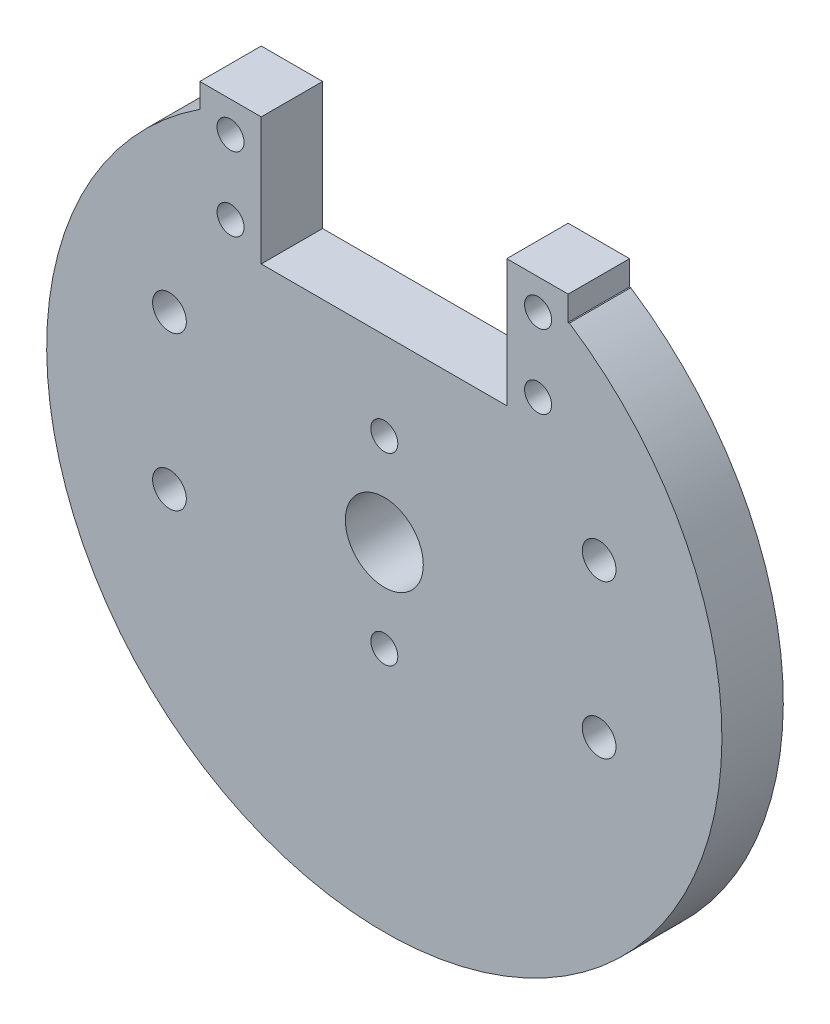
ISO-10303-21;
HEADER;
FILE_DESCRIPTION(('STEP AP214'),'2;1');
FILE_NAME('part.step','',(''),(''),'','','');
FILE_SCHEMA(('AUTOMOTIVE_DESIGN { 1 0 10303 214 1 1 1 1 }'));
ENDSEC;
DATA;
#1=APPLICATION_CONTEXT('core data for automotive mechanical design processes');
#2=APPLICATION_PROTOCOL_DEFINITION('international standard','automotive_design',2000,#1);
#3=PRODUCT_CONTEXT('',#1,'mechanical');
#4=PRODUCT('Part','Part','',(#3));
#5=PRODUCT_RELATED_PRODUCT_CATEGORY('part','',(#4));
#6=PRODUCT_DEFINITION_FORMATION('','',#4);
#7=PRODUCT_DEFINITION_CONTEXT('part definition',#1,'design');
#8=PRODUCT_DEFINITION('design','',#6,#7);
#9=PRODUCT_DEFINITION_SHAPE('','',#8);
#10=(LENGTH_UNIT() NAMED_UNIT(*) SI_UNIT(.MILLI.,.METRE.));
#11=(NAMED_UNIT(*) PLANE_ANGLE_UNIT() SI_UNIT($,.RADIAN.));
#12=(NAMED_UNIT(*) SI_UNIT($,.STERADIAN.) SOLID_ANGLE_UNIT());
#13=UNCERTAINTY_MEASURE_WITH_UNIT(LENGTH_MEASURE(1.E-05),#10,'distance_accuracy_value','');
#14=(GEOMETRIC_REPRESENTATION_CONTEXT(3) GLOBAL_UNCERTAINTY_ASSIGNED_CONTEXT((#13)) GLOBAL_UNIT_ASSIGNED_CONTEXT((#10,
#11,#12)) REPRESENTATION_CONTEXT('',''));
#15=CARTESIAN_POINT('',(0.,0.,0.));
#16=DIRECTION('',(0.,0.,1.));
#17=DIRECTION('',(1.,0.,0.));
#18=AXIS2_PLACEMENT_3D('',#15,#16,#17);
#19=CARTESIAN_POINT('',(0.,0.,10.));
#20=DIRECTION('',(0.,0.,-1.));
#21=DIRECTION('',(-1.,0.,0.));
#22=AXIS2_PLACEMENT_3D('',#19,#20,#21);
#23=CYLINDRICAL_SURFACE('',#22,55.);
#24=CARTESIAN_POINT('',(0.,0.,10.));
#25=DIRECTION('',(0.,0.,1.));
#26=DIRECTION('',(1.,0.,0.));
#27=AXIS2_PLACEMENT_3D('',#24,#25,#26);
#28=CIRCLE('',#27,55.);
#29=CARTESIAN_POINT('',(-30.1496268633627,46.,10.));
#30=VERTEX_POINT('',#29);
#31=CARTESIAN_POINT('',(30.1496268633627,46.,10.));
#32=VERTEX_POINT('',#31);
#33=EDGE_CURVE('E215',#30,#32,#28,.T.);
#34=ORIENTED_EDGE('',*,*,#33,.F.);
#35=DIRECTION('',(0.,0.,1.));
#36=VECTOR('',#35,1.);
#37=CARTESIAN_POINT('',(-30.1496268633627,46.,-76.5172654972579));
#38=LINE('',#37,#36);
#39=CARTESIAN_POINT('',(-30.1496268633627,46.,0.));
#40=VERTEX_POINT('',#39);
#41=EDGE_CURVE('E206',#40,#30,#38,.T.);
#42=ORIENTED_EDGE('',*,*,#41,.F.);
#43=CARTESIAN_POINT('',(0.,0.,0.));
#44=DIRECTION('',(0.,0.,1.));
#45=DIRECTION('',(1.,0.,0.));
#46=AXIS2_PLACEMENT_3D('',#43,#44,#45);
#47=CIRCLE('',#46,55.);
#48=CARTESIAN_POINT('',(30.1496268633627,46.,0.));
#49=VERTEX_POINT('',#48);
#50=EDGE_CURVE('E214',#40,#49,#47,.T.);
#51=ORIENTED_EDGE('',*,*,#50,.T.);
#52=DIRECTION('',(0.,0.,1.));
#53=VECTOR('',#52,1.);
#54=CARTESIAN_POINT('',(30.1496268633627,46.,-76.5172654972579));
#55=LINE('',#54,#53);
#56=EDGE_CURVE('E200',#49,#32,#55,.T.);
#57=ORIENTED_EDGE('',*,*,#56,.T.);
#58=EDGE_LOOP('',(#34,#42,#51,#57));
#59=FACE_BOUND('',#58,.T.);
#60=ADVANCED_FACE('F43',(#59),#23,.T.);
#61=CARTESIAN_POINT('',(0.,0.,10.));
#62=DIRECTION('',(0.,0.,1.));
#63=DIRECTION('',(1.,0.,0.));
#64=AXIS2_PLACEMENT_3D('',#61,#62,#63);
#65=PLANE('',#64);
#66=CARTESIAN_POINT('',(35.,15.,10.));
#67=DIRECTION('',(0.,0.,1.));
#68=DIRECTION('',(-1.,0.,0.));
#69=AXIS2_PLACEMENT_3D('',#66,#67,#68);
#70=CIRCLE('',#69,2.74999999999999);
#71=CARTESIAN_POINT('',(32.25,15.,10.));
#72=VERTEX_POINT('',#71);
#73=EDGE_CURVE('E275',#72,#72,#70,.T.);
#74=ORIENTED_EDGE('',*,*,#73,.F.);
#75=EDGE_LOOP('',(#74));
#76=FACE_BOUND('',#75,.T.);
#77=CARTESIAN_POINT('',(35.,-10.,10.));
#78=DIRECTION('',(0.,0.,1.));
#79=DIRECTION('',(-1.,0.,0.));
#80=AXIS2_PLACEMENT_3D('',#77,#78,#79);
#81=CIRCLE('',#80,2.74999999999999);
#82=CARTESIAN_POINT('',(32.25,-10.,10.));
#83=VERTEX_POINT('',#82);
#84=EDGE_CURVE('E279',#83,#83,#81,.T.);
#85=ORIENTED_EDGE('',*,*,#84,.F.);
#86=EDGE_LOOP('',(#85));
#87=FACE_BOUND('',#86,.T.);
#88=CARTESIAN_POINT('',(-35.,-10.,10.));
#89=DIRECTION('',(0.,0.,1.));
#90=DIRECTION('',(1.,0.,0.));
#91=AXIS2_PLACEMENT_3D('',#88,#89,#90);
#92=CIRCLE('',#91,2.74999999999999);
#93=CARTESIAN_POINT('',(-32.25,-10.,10.));
#94=VERTEX_POINT('',#93);
#95=EDGE_CURVE('E283',#94,#94,#92,.T.);
#96=ORIENTED_EDGE('',*,*,#95,.F.);
#97=EDGE_LOOP('',(#96));
#98=FACE_BOUND('',#97,.T.);
#99=CARTESIAN_POINT('',(-35.,15.,10.));
#100=DIRECTION('',(0.,0.,1.));
#101=DIRECTION('',(1.,0.,0.));
#102=AXIS2_PLACEMENT_3D('',#99,#100,#101);
#103=CIRCLE('',#102,2.74999999999999);
#104=CARTESIAN_POINT('',(-32.25,15.,10.));
#105=VERTEX_POINT('',#104);
#106=EDGE_CURVE('E287',#105,#105,#103,.T.);
#107=ORIENTED_EDGE('',*,*,#106,.F.);
#108=EDGE_LOOP('',(#107));
#109=FACE_BOUND('',#108,.T.);
#110=CARTESIAN_POINT('',(0.,15.,10.));
#111=DIRECTION('',(0.,0.,1.));
#112=DIRECTION('',(1.,0.,0.));
#113=AXIS2_PLACEMENT_3D('',#110,#111,#112);
#114=CIRCLE('',#113,2.2);
#115=CARTESIAN_POINT('',(2.2,15.,10.));
#116=VERTEX_POINT('',#115);
#117=EDGE_CURVE('E291',#116,#116,#114,.T.);
#118=ORIENTED_EDGE('',*,*,#117,.F.);
#119=EDGE_LOOP('',(#118));
#120=FACE_BOUND('',#119,.T.);
#121=CARTESIAN_POINT('',(3.23790517374325E-13,-15.,10.));
#122=DIRECTION('',(0.,0.,1.));
#123=DIRECTION('',(1.,0.,0.));
#124=AXIS2_PLACEMENT_3D('',#121,#122,#123);
#125=CIRCLE('',#124,2.2);
#126=CARTESIAN_POINT('',(2.20000000000032,-15.,10.));
#127=VERTEX_POINT('',#126);
#128=EDGE_CURVE('E295',#127,#127,#125,.T.);
#129=ORIENTED_EDGE('',*,*,#128,.F.);
#130=EDGE_LOOP('',(#129));
#131=FACE_BOUND('',#130,.T.);
#132=CARTESIAN_POINT('',(0.,0.,10.));
#133=DIRECTION('',(0.,0.,1.));
#134=DIRECTION('',(1.,0.,0.));
#135=AXIS2_PLACEMENT_3D('',#132,#133,#134);
#136=CIRCLE('',#135,6.35);
#137=CARTESIAN_POINT('',(6.35,0.,10.));
#138=VERTEX_POINT('',#137);
#139=EDGE_CURVE('E299',#138,#138,#136,.T.);
#140=ORIENTED_EDGE('',*,*,#139,.F.);
#141=EDGE_LOOP('',(#140));
#142=FACE_BOUND('',#141,.T.);
#143=CARTESIAN_POINT('',(25.0506039403765,45.,10.));
#144=DIRECTION('',(0.,0.,1.));
#145=DIRECTION('',(-1.,0.,0.));
#146=AXIS2_PLACEMENT_3D('',#143,#144,#145);
#147=CIRCLE('',#146,2.2);
#148=CARTESIAN_POINT('',(22.8506039403765,45.,10.));
#149=VERTEX_POINT('',#148);
#150=EDGE_CURVE('E303',#149,#149,#147,.T.);
#151=ORIENTED_EDGE('',*,*,#150,.F.);
#152=EDGE_LOOP('',(#151));
#153=FACE_BOUND('',#152,.T.);
#154=CARTESIAN_POINT('',(25.0506039403765,33.,10.));
#155=DIRECTION('',(0.,0.,1.));
#156=DIRECTION('',(1.,0.,0.));
#157=AXIS2_PLACEMENT_3D('',#154,#155,#156);
#158=CIRCLE('',#157,2.2);
#159=CARTESIAN_POINT('',(27.2506039403765,33.,10.));
#160=VERTEX_POINT('',#159);
#161=EDGE_CURVE('E307',#160,#160,#158,.T.);
#162=ORIENTED_EDGE('',*,*,#161,.F.);
#163=EDGE_LOOP('',(#162));
#164=FACE_BOUND('',#163,.T.);
#165=CARTESIAN_POINT('',(-25.0506039403765,33.,10.));
#166=DIRECTION('',(0.,0.,1.));
#167=DIRECTION('',(-1.,0.,0.));
#168=AXIS2_PLACEMENT_3D('',#165,#166,#167);
#169=CIRCLE('',#168,2.2);
#170=CARTESIAN_POINT('',(-27.2506039403765,33.,10.));
#171=VERTEX_POINT('',#170);
#172=EDGE_CURVE('E311',#171,#171,#169,.T.);
#173=ORIENTED_EDGE('',*,*,#172,.F.);
#174=EDGE_LOOP('',(#173));
#175=FACE_BOUND('',#174,.T.);
#176=CARTESIAN_POINT('',(-25.0506039403765,45.,10.));
#177=DIRECTION('',(0.,0.,1.));
#178=DIRECTION('',(1.,0.,0.));
#179=AXIS2_PLACEMENT_3D('',#176,#177,#178);
#180=CIRCLE('',#179,2.2);
#181=CARTESIAN_POINT('',(-22.8506039403765,45.,10.));
#182=VERTEX_POINT('',#181);
#183=EDGE_CURVE('E314',#182,#182,#180,.T.);
#184=ORIENTED_EDGE('',*,*,#183,.F.);
#185=EDGE_LOOP('',(#184));
#186=FACE_BOUND('',#185,.T.);
#187=DIRECTION('',(1.,0.,0.));
#188=VECTOR('',#187,1.);
#189=CARTESIAN_POINT('',(19.9493960596235,46.,10.));
#190=LINE('',#189,#188);
#191=CARTESIAN_POINT('',(29.9493960596235,46.,10.));
#192=VERTEX_POINT('',#191);
#193=EDGE_CURVE('E123',#192,#32,#190,.T.);
#194=ORIENTED_EDGE('',*,*,#193,.F.);
#195=DIRECTION('',(0.,1.,0.));
#196=VECTOR('',#195,1.);
#197=CARTESIAN_POINT('',(29.9493960596235,29.25,10.));
#198=LINE('',#197,#196);
#199=CARTESIAN_POINT('',(29.9493960596235,50.,10.));
#200=VERTEX_POINT('',#199);
#201=EDGE_CURVE('E116',#192,#200,#198,.T.);
#202=ORIENTED_EDGE('',*,*,#201,.T.);
#203=DIRECTION('',(-1.,0.,0.));
#204=VECTOR('',#203,1.);
#205=CARTESIAN_POINT('',(19.9493960596235,50.,10.));
#206=LINE('',#205,#204);
#207=CARTESIAN_POINT('',(19.9493960596235,50.,10.));
#208=VERTEX_POINT('',#207);
#209=EDGE_CURVE('E121',#200,#208,#206,.T.);
#210=ORIENTED_EDGE('',*,*,#209,.T.);
#211=DIRECTION('',(0.,1.,0.));
#212=VECTOR('',#211,1.);
#213=CARTESIAN_POINT('',(19.9493960596235,46.,10.));
#214=LINE('',#213,#212);
#215=CARTESIAN_POINT('',(19.9493960596235,29.25,10.));
#216=VERTEX_POINT('',#215);
#217=EDGE_CURVE('E171',#216,#208,#214,.T.);
#218=ORIENTED_EDGE('',*,*,#217,.F.);
#219=DIRECTION('',(1.,0.,0.));
#220=VECTOR('',#219,1.);
#221=CARTESIAN_POINT('',(-20.0506039403765,29.25,10.));
#222=LINE('',#221,#220);
#223=CARTESIAN_POINT('',(-20.0506039403765,29.25,10.));
#224=VERTEX_POINT('',#223);
#225=EDGE_CURVE('E196',#224,#216,#222,.T.);
#226=ORIENTED_EDGE('',*,*,#225,.F.);
#227=DIRECTION('',(0.,-1.,0.));
#228=VECTOR('',#227,1.);
#229=CARTESIAN_POINT('',(-20.0506039403765,46.,10.));
#230=LINE('',#229,#228);
#231=CARTESIAN_POINT('',(-20.0506039403765,50.,10.));
#232=VERTEX_POINT('',#231);
#233=EDGE_CURVE('E192',#232,#224,#230,.T.);
#234=ORIENTED_EDGE('',*,*,#233,.F.);
#235=DIRECTION('',(-1.,0.,0.));
#236=VECTOR('',#235,1.);
#237=CARTESIAN_POINT('',(-20.0506039403765,50.,10.));
#238=LINE('',#237,#236);
#239=CARTESIAN_POINT('',(-30.0506039403765,50.,10.));
#240=VERTEX_POINT('',#239);
#241=EDGE_CURVE('E153',#232,#240,#238,.T.);
#242=ORIENTED_EDGE('',*,*,#241,.T.);
#243=DIRECTION('',(0.,-1.,0.));
#244=VECTOR('',#243,1.);
#245=CARTESIAN_POINT('',(-30.0506039403765,29.25,10.));
#246=LINE('',#245,#244);
#247=CARTESIAN_POINT('',(-30.0506039403765,46.,10.));
#248=VERTEX_POINT('',#247);
#249=EDGE_CURVE('E157',#240,#248,#246,.T.);
#250=ORIENTED_EDGE('',*,*,#249,.T.);
#251=DIRECTION('',(1.,0.,0.));
#252=VECTOR('',#251,1.);
#253=CARTESIAN_POINT('',(-30.1496268633627,46.,10.));
#254=LINE('',#253,#252);
#255=EDGE_CURVE('E189',#30,#248,#254,.T.);
#256=ORIENTED_EDGE('',*,*,#255,.F.);
#257=ORIENTED_EDGE('',*,*,#33,.T.);
#258=EDGE_LOOP('',(#194,#202,#210,#218,#226,#234,#242,#250,#256,#257));
#259=FACE_BOUND('',#258,.T.);
#260=ADVANCED_FACE('F118',(#76,#87,#98,#109,#120,#131,#142,#153,#164,#175,#186,#259),#65,.T.);
#261=CARTESIAN_POINT('',(0.,0.,0.));
#262=DIRECTION('',(0.,0.,1.));
#263=DIRECTION('',(1.,0.,0.));
#264=AXIS2_PLACEMENT_3D('',#261,#262,#263);
#265=PLANE('',#264);
#266=CARTESIAN_POINT('',(35.,15.,0.));
#267=DIRECTION('',(0.,0.,1.));
#268=DIRECTION('',(1.,0.,0.));
#269=AXIS2_PLACEMENT_3D('',#266,#267,#268);
#270=CIRCLE('',#269,2.74999999999999);
#271=CARTESIAN_POINT('',(37.75,15.,0.));
#272=VERTEX_POINT('',#271);
#273=EDGE_CURVE('E368',#272,#272,#270,.F.);
#274=ORIENTED_EDGE('',*,*,#273,.F.);
#275=EDGE_LOOP('',(#274));
#276=FACE_BOUND('',#275,.T.);
#277=CARTESIAN_POINT('',(35.,-10.,0.));
#278=DIRECTION('',(0.,0.,1.));
#279=DIRECTION('',(1.,0.,0.));
#280=AXIS2_PLACEMENT_3D('',#277,#278,#279);
#281=CIRCLE('',#280,2.74999999999999);
#282=CARTESIAN_POINT('',(37.75,-10.,0.));
#283=VERTEX_POINT('',#282);
#284=EDGE_CURVE('E374',#283,#283,#281,.F.);
#285=ORIENTED_EDGE('',*,*,#284,.F.);
#286=EDGE_LOOP('',(#285));
#287=FACE_BOUND('',#286,.T.);
#288=CARTESIAN_POINT('',(-35.,-10.,0.));
#289=DIRECTION('',(0.,0.,1.));
#290=DIRECTION('',(1.,0.,0.));
#291=AXIS2_PLACEMENT_3D('',#288,#289,#290);
#292=CIRCLE('',#291,2.74999999999999);
#293=CARTESIAN_POINT('',(-32.25,-10.,0.));
#294=VERTEX_POINT('',#293);
#295=EDGE_CURVE('E367',#294,#294,#292,.F.);
#296=ORIENTED_EDGE('',*,*,#295,.F.);
#297=EDGE_LOOP('',(#296));
#298=FACE_BOUND('',#297,.T.);
#299=CARTESIAN_POINT('',(-35.,15.,0.));
#300=DIRECTION('',(0.,0.,1.));
#301=DIRECTION('',(1.,0.,0.));
#302=AXIS2_PLACEMENT_3D('',#299,#300,#301);
#303=CIRCLE('',#302,2.74999999999999);
#304=CARTESIAN_POINT('',(-32.25,15.,0.));
#305=VERTEX_POINT('',#304);
#306=EDGE_CURVE('E356',#305,#305,#303,.F.);
#307=ORIENTED_EDGE('',*,*,#306,.F.);
#308=EDGE_LOOP('',(#307));
#309=FACE_BOUND('',#308,.T.);
#310=CARTESIAN_POINT('',(0.,15.,0.));
#311=DIRECTION('',(0.,0.,1.));
#312=DIRECTION('',(1.,0.,0.));
#313=AXIS2_PLACEMENT_3D('',#310,#311,#312);
#314=CIRCLE('',#313,2.2);
#315=CARTESIAN_POINT('',(2.2,15.,0.));
#316=VERTEX_POINT('',#315);
#317=EDGE_CURVE('E349',#316,#316,#314,.F.);
#318=ORIENTED_EDGE('',*,*,#317,.F.);
#319=EDGE_LOOP('',(#318));
#320=FACE_BOUND('',#319,.T.);
#321=CARTESIAN_POINT('',(3.23790517374325E-13,-15.,0.));
#322=DIRECTION('',(0.,0.,1.));
#323=DIRECTION('',(1.,0.,0.));
#324=AXIS2_PLACEMENT_3D('',#321,#322,#323);
#325=CIRCLE('',#324,2.2);
#326=CARTESIAN_POINT('',(2.20000000000032,-15.,0.));
#327=VERTEX_POINT('',#326);
#328=EDGE_CURVE('E350',#327,#327,#325,.F.);
#329=ORIENTED_EDGE('',*,*,#328,.F.);
#330=EDGE_LOOP('',(#329));
#331=FACE_BOUND('',#330,.T.);
#332=CARTESIAN_POINT('',(0.,0.,0.));
#333=DIRECTION('',(0.,0.,1.));
#334=DIRECTION('',(1.,0.,0.));
#335=AXIS2_PLACEMENT_3D('',#332,#333,#334);
#336=CIRCLE('',#335,6.35);
#337=CARTESIAN_POINT('',(6.35,0.,0.));
#338=VERTEX_POINT('',#337);
#339=EDGE_CURVE('E335',#338,#338,#336,.F.);
#340=ORIENTED_EDGE('',*,*,#339,.F.);
#341=EDGE_LOOP('',(#340));
#342=FACE_BOUND('',#341,.T.);
#343=CARTESIAN_POINT('',(25.0506039403765,45.,0.));
#344=DIRECTION('',(0.,0.,1.));
#345=DIRECTION('',(1.,0.,0.));
#346=AXIS2_PLACEMENT_3D('',#343,#344,#345);
#347=CIRCLE('',#346,2.2);
#348=CARTESIAN_POINT('',(27.2506039403765,45.,0.));
#349=VERTEX_POINT('',#348);
#350=EDGE_CURVE('E326',#349,#349,#347,.F.);
#351=ORIENTED_EDGE('',*,*,#350,.F.);
#352=EDGE_LOOP('',(#351));
#353=FACE_BOUND('',#352,.T.);
#354=CARTESIAN_POINT('',(25.0506039403765,33.,0.));
#355=DIRECTION('',(0.,0.,1.));
#356=DIRECTION('',(1.,0.,0.));
#357=AXIS2_PLACEMENT_3D('',#354,#355,#356);
#358=CIRCLE('',#357,2.2);
#359=CARTESIAN_POINT('',(27.2506039403765,33.,0.));
#360=VERTEX_POINT('',#359);
#361=EDGE_CURVE('E336',#360,#360,#358,.F.);
#362=ORIENTED_EDGE('',*,*,#361,.F.);
#363=EDGE_LOOP('',(#362));
#364=FACE_BOUND('',#363,.T.);
#365=CARTESIAN_POINT('',(-25.0506039403765,33.,0.));
#366=DIRECTION('',(0.,0.,1.));
#367=DIRECTION('',(1.,0.,0.));
#368=AXIS2_PLACEMENT_3D('',#365,#366,#367);
#369=CIRCLE('',#368,2.2);
#370=CARTESIAN_POINT('',(-22.8506039403765,33.,0.));
#371=VERTEX_POINT('',#370);
#372=EDGE_CURVE('E317',#371,#371,#369,.F.);
#373=ORIENTED_EDGE('',*,*,#372,.F.);
#374=EDGE_LOOP('',(#373));
#375=FACE_BOUND('',#374,.T.);
#376=CARTESIAN_POINT('',(-25.0506039403765,45.,0.));
#377=DIRECTION('',(0.,0.,1.));
#378=DIRECTION('',(1.,0.,0.));
#379=AXIS2_PLACEMENT_3D('',#376,#377,#378);
#380=CIRCLE('',#379,2.2);
#381=CARTESIAN_POINT('',(-22.8506039403765,45.,0.));
#382=VERTEX_POINT('',#381);
#383=EDGE_CURVE('E126',#382,#382,#380,.F.);
#384=ORIENTED_EDGE('',*,*,#383,.F.);
#385=EDGE_LOOP('',(#384));
#386=FACE_BOUND('',#385,.T.);
#387=DIRECTION('',(0.,-1.,0.));
#388=VECTOR('',#387,1.);
#389=CARTESIAN_POINT('',(29.9493960596235,29.25,0.));
#390=LINE('',#389,#388);
#391=CARTESIAN_POINT('',(29.9493960596235,50.,0.));
#392=VERTEX_POINT('',#391);
#393=CARTESIAN_POINT('',(29.9493960596235,46.,0.));
#394=VERTEX_POINT('',#393);
#395=EDGE_CURVE('E133',#392,#394,#390,.T.);
#396=ORIENTED_EDGE('',*,*,#395,.T.);
#397=DIRECTION('',(-1.,0.,0.));
#398=VECTOR('',#397,1.);
#399=CARTESIAN_POINT('',(19.9493960596235,46.,0.));
#400=LINE('',#399,#398);
#401=EDGE_CURVE('E61',#49,#394,#400,.T.);
#402=ORIENTED_EDGE('',*,*,#401,.F.);
#403=ORIENTED_EDGE('',*,*,#50,.F.);
#404=DIRECTION('',(-1.,0.,0.));
#405=VECTOR('',#404,1.);
#406=CARTESIAN_POINT('',(-30.1496268633627,46.,0.));
#407=LINE('',#406,#405);
#408=CARTESIAN_POINT('',(-30.0506039403765,46.,0.));
#409=VERTEX_POINT('',#408);
#410=EDGE_CURVE('E172',#409,#40,#407,.T.);
#411=ORIENTED_EDGE('',*,*,#410,.F.);
#412=DIRECTION('',(0.,1.,0.));
#413=VECTOR('',#412,1.);
#414=CARTESIAN_POINT('',(-30.0506039403765,29.25,0.));
#415=LINE('',#414,#413);
#416=CARTESIAN_POINT('',(-30.0506039403765,50.,0.));
#417=VERTEX_POINT('',#416);
#418=EDGE_CURVE('E148',#409,#417,#415,.T.);
#419=ORIENTED_EDGE('',*,*,#418,.T.);
#420=DIRECTION('',(1.,0.,0.));
#421=VECTOR('',#420,1.);
#422=CARTESIAN_POINT('',(-20.0506039403765,50.,0.));
#423=LINE('',#422,#421);
#424=CARTESIAN_POINT('',(-20.0506039403765,50.,0.));
#425=VERTEX_POINT('',#424);
#426=EDGE_CURVE('E151',#417,#425,#423,.T.);
#427=ORIENTED_EDGE('',*,*,#426,.T.);
#428=DIRECTION('',(0.,1.,0.));
#429=VECTOR('',#428,1.);
#430=CARTESIAN_POINT('',(-20.0506039403765,46.,0.));
#431=LINE('',#430,#429);
#432=CARTESIAN_POINT('',(-20.0506039403765,29.25,0.));
#433=VERTEX_POINT('',#432);
#434=EDGE_CURVE('E175',#433,#425,#431,.T.);
#435=ORIENTED_EDGE('',*,*,#434,.F.);
#436=DIRECTION('',(-1.,0.,0.));
#437=VECTOR('',#436,1.);
#438=CARTESIAN_POINT('',(-20.0506039403765,29.25,0.));
#439=LINE('',#438,#437);
#440=CARTESIAN_POINT('',(19.9493960596235,29.25,0.));
#441=VERTEX_POINT('',#440);
#442=EDGE_CURVE('E179',#441,#433,#439,.T.);
#443=ORIENTED_EDGE('',*,*,#442,.F.);
#444=DIRECTION('',(0.,-1.,0.));
#445=VECTOR('',#444,1.);
#446=CARTESIAN_POINT('',(19.9493960596235,46.,0.));
#447=LINE('',#446,#445);
#448=CARTESIAN_POINT('',(19.9493960596235,50.,0.));
#449=VERTEX_POINT('',#448);
#450=EDGE_CURVE('E182',#449,#441,#447,.T.);
#451=ORIENTED_EDGE('',*,*,#450,.F.);
#452=DIRECTION('',(1.,0.,0.));
#453=VECTOR('',#452,1.);
#454=CARTESIAN_POINT('',(19.9493960596235,50.,0.));
#455=LINE('',#454,#453);
#456=EDGE_CURVE('E158',#449,#392,#455,.T.);
#457=ORIENTED_EDGE('',*,*,#456,.T.);
#458=EDGE_LOOP('',(#396,#402,#403,#411,#419,#427,#435,#443,#451,#457));
#459=FACE_BOUND('',#458,.T.);
#460=ADVANCED_FACE('F234',(#276,#287,#298,#309,#320,#331,#342,#353,#364,#375,#386,#459),#265,.F.);
#461=CARTESIAN_POINT('',(19.9493960596235,46.,-76.5172654972579));
#462=DIRECTION('',(1.,0.,0.));
#463=DIRECTION('',(0.,0.,-1.));
#464=AXIS2_PLACEMENT_3D('',#461,#462,#463);
#465=PLANE('',#464);
#466=ORIENTED_EDGE('',*,*,#450,.T.);
#467=DIRECTION('',(0.,0.,1.));
#468=VECTOR('',#467,1.);
#469=CARTESIAN_POINT('',(19.9493960596235,29.25,-76.5172654972579));
#470=LINE('',#469,#468);
#471=EDGE_CURVE('E176',#441,#216,#470,.T.);
#472=ORIENTED_EDGE('',*,*,#471,.T.);
#473=ORIENTED_EDGE('',*,*,#217,.T.);
#474=DIRECTION('',(0.,0.,1.));
#475=VECTOR('',#474,1.);
#476=CARTESIAN_POINT('',(19.9493960596235,50.,-23.0339423460249));
#477=LINE('',#476,#475);
#478=EDGE_CURVE('E137',#449,#208,#477,.T.);
#479=ORIENTED_EDGE('',*,*,#478,.F.);
#480=EDGE_LOOP('',(#466,#472,#473,#479));
#481=FACE_BOUND('',#480,.T.);
#482=ADVANCED_FACE('F252',(#481),#465,.F.);
#483=CARTESIAN_POINT('',(-20.0506039403765,29.25,-76.5172654972579));
#484=DIRECTION('',(0.,-1.,0.));
#485=DIRECTION('',(0.,0.,-1.));
#486=AXIS2_PLACEMENT_3D('',#483,#484,#485);
#487=PLANE('',#486);
#488=ORIENTED_EDGE('',*,*,#442,.T.);
#489=DIRECTION('',(0.,0.,1.));
#490=VECTOR('',#489,1.);
#491=CARTESIAN_POINT('',(-20.0506039403765,29.25,-76.5172654972579));
#492=LINE('',#491,#490);
#493=EDGE_CURVE('E203',#433,#224,#492,.T.);
#494=ORIENTED_EDGE('',*,*,#493,.T.);
#495=ORIENTED_EDGE('',*,*,#225,.T.);
#496=ORIENTED_EDGE('',*,*,#471,.F.);
#497=EDGE_LOOP('',(#488,#494,#495,#496));
#498=FACE_BOUND('',#497,.T.);
#499=ADVANCED_FACE('F250',(#498),#487,.F.);
#500=CARTESIAN_POINT('',(-20.0506039403765,46.,-76.5172654972579));
#501=DIRECTION('',(-1.,0.,0.));
#502=DIRECTION('',(0.,0.,1.));
#503=AXIS2_PLACEMENT_3D('',#500,#501,#502);
#504=PLANE('',#503);
#505=ORIENTED_EDGE('',*,*,#434,.T.);
#506=DIRECTION('',(0.,0.,1.));
#507=VECTOR('',#506,1.);
#508=CARTESIAN_POINT('',(-20.0506039403765,50.,-23.0339423460249));
#509=LINE('',#508,#507);
#510=EDGE_CURVE('E162',#425,#232,#509,.T.);
#511=ORIENTED_EDGE('',*,*,#510,.T.);
#512=ORIENTED_EDGE('',*,*,#233,.T.);
#513=ORIENTED_EDGE('',*,*,#493,.F.);
#514=EDGE_LOOP('',(#505,#511,#512,#513));
#515=FACE_BOUND('',#514,.T.);
#516=ADVANCED_FACE('F245',(#515),#504,.F.);
#517=CARTESIAN_POINT('',(-30.1496268633627,46.,-76.5172654972579));
#518=DIRECTION('',(0.,-1.,0.));
#519=DIRECTION('',(0.,0.,-1.));
#520=AXIS2_PLACEMENT_3D('',#517,#518,#519);
#521=PLANE('',#520);
#522=ORIENTED_EDGE('',*,*,#255,.T.);
#523=DIRECTION('',(0.,0.,-1.));
#524=VECTOR('',#523,1.);
#525=CARTESIAN_POINT('',(-30.0506039403765,46.,-76.5172654972579));
#526=LINE('',#525,#524);
#527=EDGE_CURVE('E51',#248,#409,#526,.T.);
#528=ORIENTED_EDGE('',*,*,#527,.T.);
#529=ORIENTED_EDGE('',*,*,#410,.T.);
#530=ORIENTED_EDGE('',*,*,#41,.T.);
#531=EDGE_LOOP('',(#522,#528,#529,#530));
#532=FACE_BOUND('',#531,.T.);
#533=ADVANCED_FACE('F225',(#532),#521,.F.);
#534=CARTESIAN_POINT('',(19.9493960596235,46.,-76.5172654972579));
#535=DIRECTION('',(0.,-1.,0.));
#536=DIRECTION('',(0.,0.,-1.));
#537=AXIS2_PLACEMENT_3D('',#534,#535,#536);
#538=PLANE('',#537);
#539=ORIENTED_EDGE('',*,*,#401,.T.);
#540=DIRECTION('',(0.,0.,1.));
#541=VECTOR('',#540,1.);
#542=CARTESIAN_POINT('',(29.9493960596235,46.,-76.5172654972579));
#543=LINE('',#542,#541);
#544=EDGE_CURVE('E11',#394,#192,#543,.T.);
#545=ORIENTED_EDGE('',*,*,#544,.T.);
#546=ORIENTED_EDGE('',*,*,#193,.T.);
#547=ORIENTED_EDGE('',*,*,#56,.F.);
#548=EDGE_LOOP('',(#539,#545,#546,#547));
#549=FACE_BOUND('',#548,.T.);
#550=ADVANCED_FACE('F437',(#549),#538,.F.);
#551=CARTESIAN_POINT('',(-30.0506039403765,29.25,-23.0339423460249));
#552=DIRECTION('',(-1.,0.,0.));
#553=DIRECTION('',(0.,0.,1.));
#554=AXIS2_PLACEMENT_3D('',#551,#552,#553);
#555=PLANE('',#554);
#556=ORIENTED_EDGE('',*,*,#527,.F.);
#557=ORIENTED_EDGE('',*,*,#249,.F.);
#558=DIRECTION('',(0.,0.,1.));
#559=VECTOR('',#558,1.);
#560=CARTESIAN_POINT('',(-30.0506039403765,50.,-23.0339423460249));
#561=LINE('',#560,#559);
#562=EDGE_CURVE('E152',#417,#240,#561,.T.);
#563=ORIENTED_EDGE('',*,*,#562,.F.);
#564=ORIENTED_EDGE('',*,*,#418,.F.);
#565=EDGE_LOOP('',(#556,#557,#563,#564));
#566=FACE_BOUND('',#565,.T.);
#567=ADVANCED_FACE('F231',(#566),#555,.T.);
#568=CARTESIAN_POINT('',(-20.0506039403765,50.,-23.0339423460249));
#569=DIRECTION('',(0.,1.,0.));
#570=DIRECTION('',(0.,0.,1.));
#571=AXIS2_PLACEMENT_3D('',#568,#569,#570);
#572=PLANE('',#571);
#573=ORIENTED_EDGE('',*,*,#426,.F.);
#574=ORIENTED_EDGE('',*,*,#562,.T.);
#575=ORIENTED_EDGE('',*,*,#241,.F.);
#576=ORIENTED_EDGE('',*,*,#510,.F.);
#577=EDGE_LOOP('',(#573,#574,#575,#576));
#578=FACE_BOUND('',#577,.T.);
#579=ADVANCED_FACE('F243',(#578),#572,.T.);
#580=CARTESIAN_POINT('',(29.9493960596235,29.25,-23.0339423460249));
#581=DIRECTION('',(1.,0.,0.));
#582=DIRECTION('',(0.,0.,-1.));
#583=AXIS2_PLACEMENT_3D('',#580,#581,#582);
#584=PLANE('',#583);
#585=ORIENTED_EDGE('',*,*,#544,.F.);
#586=ORIENTED_EDGE('',*,*,#395,.F.);
#587=DIRECTION('',(0.,0.,1.));
#588=VECTOR('',#587,1.);
#589=CARTESIAN_POINT('',(29.9493960596235,50.,-23.0339423460249));
#590=LINE('',#589,#588);
#591=EDGE_CURVE('E130',#392,#200,#590,.T.);
#592=ORIENTED_EDGE('',*,*,#591,.T.);
#593=ORIENTED_EDGE('',*,*,#201,.F.);
#594=EDGE_LOOP('',(#585,#586,#592,#593));
#595=FACE_BOUND('',#594,.T.);
#596=ADVANCED_FACE('F131',(#595),#584,.T.);
#597=CARTESIAN_POINT('',(19.9493960596235,50.,-23.0339423460249));
#598=DIRECTION('',(0.,1.,0.));
#599=DIRECTION('',(0.,0.,1.));
#600=AXIS2_PLACEMENT_3D('',#597,#598,#599);
#601=PLANE('',#600);
#602=ORIENTED_EDGE('',*,*,#456,.F.);
#603=ORIENTED_EDGE('',*,*,#478,.T.);
#604=ORIENTED_EDGE('',*,*,#209,.F.);
#605=ORIENTED_EDGE('',*,*,#591,.F.);
#606=EDGE_LOOP('',(#602,#603,#604,#605));
#607=FACE_BOUND('',#606,.T.);
#608=ADVANCED_FACE('F140',(#607),#601,.T.);
#609=CARTESIAN_POINT('',(-25.0506039403765,45.,-6.22253967444162));
#610=DIRECTION('',(0.,0.,1.));
#611=DIRECTION('',(1.,0.,0.));
#612=AXIS2_PLACEMENT_3D('',#609,#610,#611);
#613=CYLINDRICAL_SURFACE('',#612,2.2);
#614=ORIENTED_EDGE('',*,*,#383,.T.);
#615=EDGE_LOOP('',(#614));
#616=FACE_BOUND('',#615,.T.);
#617=ORIENTED_EDGE('',*,*,#183,.T.);
#618=EDGE_LOOP('',(#617));
#619=FACE_BOUND('',#618,.T.);
#620=ADVANCED_FACE('F420',(#616,#619),#613,.F.);
#621=CARTESIAN_POINT('',(-25.0506039403765,33.,-6.22253967444162));
#622=DIRECTION('',(0.,0.,1.));
#623=DIRECTION('',(1.,0.,0.));
#624=AXIS2_PLACEMENT_3D('',#621,#622,#623);
#625=CYLINDRICAL_SURFACE('',#624,2.2);
#626=ORIENTED_EDGE('',*,*,#372,.T.);
#627=EDGE_LOOP('',(#626));
#628=FACE_BOUND('',#627,.T.);
#629=ORIENTED_EDGE('',*,*,#172,.T.);
#630=EDGE_LOOP('',(#629));
#631=FACE_BOUND('',#630,.T.);
#632=ADVANCED_FACE('F416',(#628,#631),#625,.F.);
#633=CARTESIAN_POINT('',(25.0506039403765,33.,-6.22253967444162));
#634=DIRECTION('',(0.,0.,1.));
#635=DIRECTION('',(1.,0.,0.));
#636=AXIS2_PLACEMENT_3D('',#633,#634,#635);
#637=CYLINDRICAL_SURFACE('',#636,2.2);
#638=ORIENTED_EDGE('',*,*,#361,.T.);
#639=EDGE_LOOP('',(#638));
#640=FACE_BOUND('',#639,.T.);
#641=ORIENTED_EDGE('',*,*,#161,.T.);
#642=EDGE_LOOP('',(#641));
#643=FACE_BOUND('',#642,.T.);
#644=ADVANCED_FACE('F419',(#640,#643),#637,.F.);
#645=CARTESIAN_POINT('',(25.0506039403765,45.,-6.22253967444162));
#646=DIRECTION('',(0.,0.,1.));
#647=DIRECTION('',(1.,0.,0.));
#648=AXIS2_PLACEMENT_3D('',#645,#646,#647);
#649=CYLINDRICAL_SURFACE('',#648,2.2);
#650=ORIENTED_EDGE('',*,*,#350,.T.);
#651=EDGE_LOOP('',(#650));
#652=FACE_BOUND('',#651,.T.);
#653=ORIENTED_EDGE('',*,*,#150,.T.);
#654=EDGE_LOOP('',(#653));
#655=FACE_BOUND('',#654,.T.);
#656=ADVANCED_FACE('F414',(#652,#655),#649,.F.);
#657=CARTESIAN_POINT('',(0.,0.,-17.9605122421383));
#658=DIRECTION('',(0.,0.,1.));
#659=DIRECTION('',(1.,0.,0.));
#660=AXIS2_PLACEMENT_3D('',#657,#658,#659);
#661=CYLINDRICAL_SURFACE('',#660,6.35);
#662=ORIENTED_EDGE('',*,*,#339,.T.);
#663=EDGE_LOOP('',(#662));
#664=FACE_BOUND('',#663,.T.);
#665=ORIENTED_EDGE('',*,*,#139,.T.);
#666=EDGE_LOOP('',(#665));
#667=FACE_BOUND('',#666,.T.);
#668=ADVANCED_FACE('F410',(#664,#667),#661,.F.);
#669=CARTESIAN_POINT('',(3.23790517374325E-13,-15.,-6.22253967444162));
#670=DIRECTION('',(0.,0.,1.));
#671=DIRECTION('',(1.,0.,0.));
#672=AXIS2_PLACEMENT_3D('',#669,#670,#671);
#673=CYLINDRICAL_SURFACE('',#672,2.2);
#674=ORIENTED_EDGE('',*,*,#328,.T.);
#675=EDGE_LOOP('',(#674));
#676=FACE_BOUND('',#675,.T.);
#677=ORIENTED_EDGE('',*,*,#128,.T.);
#678=EDGE_LOOP('',(#677));
#679=FACE_BOUND('',#678,.T.);
#680=ADVANCED_FACE('F406',(#676,#679),#673,.F.);
#681=CARTESIAN_POINT('',(0.,15.,-6.22253967444162));
#682=DIRECTION('',(0.,0.,1.));
#683=DIRECTION('',(1.,0.,0.));
#684=AXIS2_PLACEMENT_3D('',#681,#682,#683);
#685=CYLINDRICAL_SURFACE('',#684,2.2);
#686=ORIENTED_EDGE('',*,*,#317,.T.);
#687=EDGE_LOOP('',(#686));
#688=FACE_BOUND('',#687,.T.);
#689=ORIENTED_EDGE('',*,*,#117,.T.);
#690=EDGE_LOOP('',(#689));
#691=FACE_BOUND('',#690,.T.);
#692=ADVANCED_FACE('F398',(#688,#691),#685,.F.);
#693=CARTESIAN_POINT('',(-35.,15.,-7.77817459305201));
#694=DIRECTION('',(0.,0.,1.));
#695=DIRECTION('',(1.,0.,0.));
#696=AXIS2_PLACEMENT_3D('',#693,#694,#695);
#697=CYLINDRICAL_SURFACE('',#696,2.74999999999999);
#698=ORIENTED_EDGE('',*,*,#306,.T.);
#699=EDGE_LOOP('',(#698));
#700=FACE_BOUND('',#699,.T.);
#701=ORIENTED_EDGE('',*,*,#106,.T.);
#702=EDGE_LOOP('',(#701));
#703=FACE_BOUND('',#702,.T.);
#704=ADVANCED_FACE('F388',(#700,#703),#697,.F.);
#705=CARTESIAN_POINT('',(-35.,-10.,-7.77817459305201));
#706=DIRECTION('',(0.,0.,1.));
#707=DIRECTION('',(1.,0.,0.));
#708=AXIS2_PLACEMENT_3D('',#705,#706,#707);
#709=CYLINDRICAL_SURFACE('',#708,2.74999999999999);
#710=ORIENTED_EDGE('',*,*,#295,.T.);
#711=EDGE_LOOP('',(#710));
#712=FACE_BOUND('',#711,.T.);
#713=ORIENTED_EDGE('',*,*,#95,.T.);
#714=EDGE_LOOP('',(#713));
#715=FACE_BOUND('',#714,.T.);
#716=ADVANCED_FACE('F385',(#712,#715),#709,.F.);
#717=CARTESIAN_POINT('',(35.,-10.,-7.77817459305201));
#718=DIRECTION('',(0.,0.,1.));
#719=DIRECTION('',(1.,0.,0.));
#720=AXIS2_PLACEMENT_3D('',#717,#718,#719);
#721=CYLINDRICAL_SURFACE('',#720,2.74999999999999);
#722=ORIENTED_EDGE('',*,*,#284,.T.);
#723=EDGE_LOOP('',(#722));
#724=FACE_BOUND('',#723,.T.);
#725=ORIENTED_EDGE('',*,*,#84,.T.);
#726=EDGE_LOOP('',(#725));
#727=FACE_BOUND('',#726,.T.);
#728=ADVANCED_FACE('F387',(#724,#727),#721,.F.);
#729=CARTESIAN_POINT('',(35.,15.,-7.77817459305201));
#730=DIRECTION('',(0.,0.,1.));
#731=DIRECTION('',(1.,0.,0.));
#732=AXIS2_PLACEMENT_3D('',#729,#730,#731);
#733=CYLINDRICAL_SURFACE('',#732,2.74999999999999);
#734=ORIENTED_EDGE('',*,*,#273,.T.);
#735=EDGE_LOOP('',(#734));
#736=FACE_BOUND('',#735,.T.);
#737=ORIENTED_EDGE('',*,*,#73,.T.);
#738=EDGE_LOOP('',(#737));
#739=FACE_BOUND('',#738,.T.);
#740=ADVANCED_FACE('F395',(#736,#739),#733,.F.);
#741=CLOSED_SHELL('',(#60,#260,#460,#482,#499,#516,#533,#550,#567,#579,#596,#608,#620,#632,#644,
#656,#668,#680,#692,#704,#716,#728,#740));
#742=MANIFOLD_SOLID_BREP('B2',#741);
#743=ADVANCED_BREP_SHAPE_REPRESENTATION('',(#18,#742),#14);
#744=SHAPE_DEFINITION_REPRESENTATION(#9,#743);
ENDSEC;
END-ISO-10303-21;
